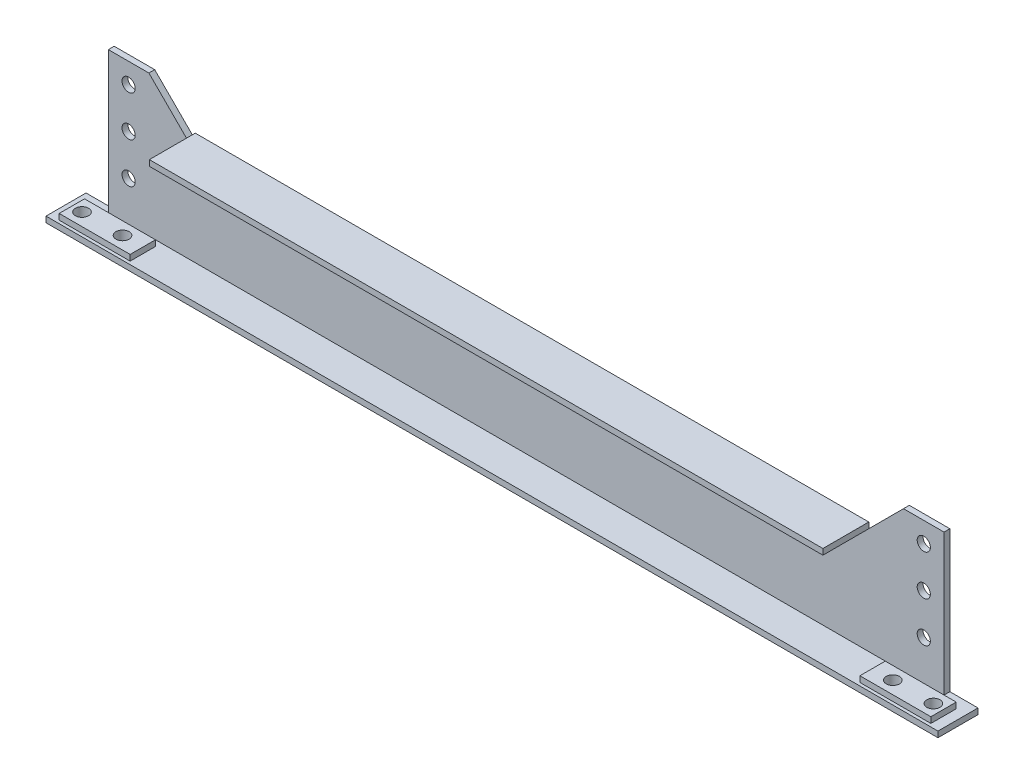
ISO-10303-21;
HEADER;
FILE_DESCRIPTION(('STEP AP214'),'2;1');
FILE_NAME('part.step','',(''),(''),'','','');
FILE_SCHEMA(('AUTOMOTIVE_DESIGN { 1 0 10303 214 1 1 1 1 }'));
ENDSEC;
DATA;
#1=APPLICATION_CONTEXT('core data for automotive mechanical design processes');
#2=APPLICATION_PROTOCOL_DEFINITION('international standard','automotive_design',2000,#1);
#3=PRODUCT_CONTEXT('',#1,'mechanical');
#4=PRODUCT('Part','Part','',(#3));
#5=PRODUCT_RELATED_PRODUCT_CATEGORY('part','',(#4));
#6=PRODUCT_DEFINITION_FORMATION('','',#4);
#7=PRODUCT_DEFINITION_CONTEXT('part definition',#1,'design');
#8=PRODUCT_DEFINITION('design','',#6,#7);
#9=PRODUCT_DEFINITION_SHAPE('','',#8);
#10=(LENGTH_UNIT() NAMED_UNIT(*) SI_UNIT(.MILLI.,.METRE.));
#11=(NAMED_UNIT(*) PLANE_ANGLE_UNIT() SI_UNIT($,.RADIAN.));
#12=(NAMED_UNIT(*) SI_UNIT($,.STERADIAN.) SOLID_ANGLE_UNIT());
#13=UNCERTAINTY_MEASURE_WITH_UNIT(LENGTH_MEASURE(1.E-05),#10,'distance_accuracy_value','');
#14=(GEOMETRIC_REPRESENTATION_CONTEXT(3) GLOBAL_UNCERTAINTY_ASSIGNED_CONTEXT((#13)) GLOBAL_UNIT_ASSIGNED_CONTEXT((#10,
#11,#12)) REPRESENTATION_CONTEXT('',''));
#15=CARTESIAN_POINT('',(0.,0.,0.));
#16=DIRECTION('',(0.,0.,1.));
#17=DIRECTION('',(1.,0.,0.));
#18=AXIS2_PLACEMENT_3D('',#15,#16,#17);
#19=CARTESIAN_POINT('',(880.,-139.25,79.));
#20=DIRECTION('',(0.,-1.,0.));
#21=DIRECTION('',(1.,0.,0.));
#22=AXIS2_PLACEMENT_3D('',#19,#20,#21);
#23=PLANE('',#22);
#24=DIRECTION('',(0.,0.,1.));
#25=VECTOR('',#24,1.);
#26=CARTESIAN_POINT('',(720.,-139.25,23.));
#27=LINE('',#26,#25);
#28=CARTESIAN_POINT('',(720.,-139.25,23.));
#29=VERTEX_POINT('',#28);
#30=CARTESIAN_POINT('',(720.,-139.25,73.));
#31=VERTEX_POINT('',#30);
#32=EDGE_CURVE('E213',#29,#31,#27,.T.);
#33=ORIENTED_EDGE('',*,*,#32,.F.);
#34=DIRECTION('',(-1.,0.,0.));
#35=VECTOR('',#34,1.);
#36=CARTESIAN_POINT('',(720.,-139.25,23.));
#37=LINE('',#36,#35);
#38=CARTESIAN_POINT('',(860.,-139.25,23.));
#39=VERTEX_POINT('',#38);
#40=EDGE_CURVE('E226',#39,#29,#37,.T.);
#41=ORIENTED_EDGE('',*,*,#40,.F.);
#42=DIRECTION('',(0.,0.,-1.));
#43=VECTOR('',#42,1.);
#44=CARTESIAN_POINT('',(860.,-139.25,23.));
#45=LINE('',#44,#43);
#46=CARTESIAN_POINT('',(860.,-139.25,73.));
#47=VERTEX_POINT('',#46);
#48=EDGE_CURVE('E235',#47,#39,#45,.T.);
#49=ORIENTED_EDGE('',*,*,#48,.F.);
#50=DIRECTION('',(1.,0.,0.));
#51=VECTOR('',#50,1.);
#52=CARTESIAN_POINT('',(720.,-139.25,73.));
#53=LINE('',#52,#51);
#54=EDGE_CURVE('E216',#31,#47,#53,.T.);
#55=ORIENTED_EDGE('',*,*,#54,.F.);
#56=EDGE_LOOP('',(#33,#41,#49,#55));
#57=FACE_BOUND('',#56,.T.);
#58=DIRECTION('',(0.,0.,-1.));
#59=VECTOR('',#58,1.);
#60=CARTESIAN_POINT('',(824.5,-139.25,11.5));
#61=LINE('',#60,#59);
#62=CARTESIAN_POINT('',(824.5,-139.25,11.5));
#63=VERTEX_POINT('',#62);
#64=CARTESIAN_POINT('',(824.5,-139.25,0.));
#65=VERTEX_POINT('',#64);
#66=EDGE_CURVE('E44',#63,#65,#61,.T.);
#67=ORIENTED_EDGE('',*,*,#66,.F.);
#68=DIRECTION('',(1.,0.,0.));
#69=VECTOR('',#68,1.);
#70=CARTESIAN_POINT('',(-824.5,-139.25,11.5));
#71=LINE('',#70,#69);
#72=CARTESIAN_POINT('',(-824.5,-139.25,11.5));
#73=VERTEX_POINT('',#72);
#74=EDGE_CURVE('E348',#73,#63,#71,.T.);
#75=ORIENTED_EDGE('',*,*,#74,.F.);
#76=DIRECTION('',(0.,0.,-1.));
#77=VECTOR('',#76,1.);
#78=CARTESIAN_POINT('',(-824.5,-139.25,11.5));
#79=LINE('',#78,#77);
#80=CARTESIAN_POINT('',(-824.5,-139.25,0.));
#81=VERTEX_POINT('',#80);
#82=EDGE_CURVE('E11',#73,#81,#79,.T.);
#83=ORIENTED_EDGE('',*,*,#82,.T.);
#84=DIRECTION('',(-1.,0.,0.));
#85=VECTOR('',#84,1.);
#86=CARTESIAN_POINT('',(880.,-139.25,0.));
#87=LINE('',#86,#85);
#88=CARTESIAN_POINT('',(-880.,-139.25,0.));
#89=VERTEX_POINT('',#88);
#90=EDGE_CURVE('E254',#81,#89,#87,.T.);
#91=ORIENTED_EDGE('',*,*,#90,.T.);
#92=DIRECTION('',(0.,0.,-1.));
#93=VECTOR('',#92,1.);
#94=CARTESIAN_POINT('',(-880.,-139.25,79.));
#95=LINE('',#94,#93);
#96=CARTESIAN_POINT('',(-880.,-139.25,79.));
#97=VERTEX_POINT('',#96);
#98=EDGE_CURVE('E277',#97,#89,#95,.T.);
#99=ORIENTED_EDGE('',*,*,#98,.F.);
#100=DIRECTION('',(-1.,0.,0.));
#101=VECTOR('',#100,1.);
#102=CARTESIAN_POINT('',(880.,-139.25,79.));
#103=LINE('',#102,#101);
#104=CARTESIAN_POINT('',(880.,-139.25,79.));
#105=VERTEX_POINT('',#104);
#106=EDGE_CURVE('E267',#105,#97,#103,.T.);
#107=ORIENTED_EDGE('',*,*,#106,.F.);
#108=DIRECTION('',(0.,0.,-1.));
#109=VECTOR('',#108,1.);
#110=CARTESIAN_POINT('',(880.,-139.25,79.));
#111=LINE('',#110,#109);
#112=CARTESIAN_POINT('',(880.,-139.25,0.));
#113=VERTEX_POINT('',#112);
#114=EDGE_CURVE('E280',#105,#113,#111,.T.);
#115=ORIENTED_EDGE('',*,*,#114,.T.);
#116=EDGE_CURVE('E255',#113,#65,#87,.T.);
#117=ORIENTED_EDGE('',*,*,#116,.T.);
#118=EDGE_LOOP('',(#67,#75,#83,#91,#99,#107,#115,#117));
#119=FACE_BOUND('',#118,.T.);
#120=DIRECTION('',(0.,0.,-1.));
#121=VECTOR('',#120,1.);
#122=CARTESIAN_POINT('',(-720.,-139.25,23.));
#123=LINE('',#122,#121);
#124=CARTESIAN_POINT('',(-720.,-139.25,73.));
#125=VERTEX_POINT('',#124);
#126=CARTESIAN_POINT('',(-720.,-139.25,23.));
#127=VERTEX_POINT('',#126);
#128=EDGE_CURVE('E212',#125,#127,#123,.T.);
#129=ORIENTED_EDGE('',*,*,#128,.F.);
#130=DIRECTION('',(1.,0.,0.));
#131=VECTOR('',#130,1.);
#132=CARTESIAN_POINT('',(-720.,-139.25,73.));
#133=LINE('',#132,#131);
#134=CARTESIAN_POINT('',(-860.,-139.25,73.));
#135=VERTEX_POINT('',#134);
#136=EDGE_CURVE('E209',#135,#125,#133,.T.);
#137=ORIENTED_EDGE('',*,*,#136,.F.);
#138=DIRECTION('',(0.,0.,1.));
#139=VECTOR('',#138,1.);
#140=CARTESIAN_POINT('',(-860.,-139.25,23.));
#141=LINE('',#140,#139);
#142=CARTESIAN_POINT('',(-860.,-139.25,23.));
#143=VERTEX_POINT('',#142);
#144=EDGE_CURVE('E57',#143,#135,#141,.T.);
#145=ORIENTED_EDGE('',*,*,#144,.F.);
#146=DIRECTION('',(-1.,0.,0.));
#147=VECTOR('',#146,1.);
#148=CARTESIAN_POINT('',(-720.,-139.25,23.));
#149=LINE('',#148,#147);
#150=EDGE_CURVE('E52',#127,#143,#149,.T.);
#151=ORIENTED_EDGE('',*,*,#150,.F.);
#152=EDGE_LOOP('',(#129,#137,#145,#151));
#153=FACE_BOUND('',#152,.T.);
#154=ADVANCED_FACE('F35',(#57,#119,#153),#23,.F.);
#155=CARTESIAN_POINT('',(-824.5,59.2499999999996,11.5));
#156=DIRECTION('',(0.,0.,1.));
#157=DIRECTION('',(1.,0.,0.));
#158=AXIS2_PLACEMENT_3D('',#155,#156,#157);
#159=PLANE('',#158);
#160=CARTESIAN_POINT('',(784.5,19.2499999999996,11.5));
#161=DIRECTION('',(0.,0.,1.));
#162=DIRECTION('',(-1.,0.,0.));
#163=AXIS2_PLACEMENT_3D('',#160,#161,#162);
#164=CIRCLE('',#163,13.);
#165=CARTESIAN_POINT('',(771.5,19.2499999999996,11.5));
#166=VERTEX_POINT('',#165);
#167=EDGE_CURVE('E316',#166,#166,#164,.T.);
#168=ORIENTED_EDGE('',*,*,#167,.F.);
#169=EDGE_LOOP('',(#168));
#170=FACE_BOUND('',#169,.T.);
#171=CARTESIAN_POINT('',(-784.5,-60.7500000000004,11.5));
#172=DIRECTION('',(0.,0.,1.));
#173=DIRECTION('',(1.,0.,0.));
#174=AXIS2_PLACEMENT_3D('',#171,#172,#173);
#175=CIRCLE('',#174,13.);
#176=CARTESIAN_POINT('',(-771.5,-60.7500000000004,11.5));
#177=VERTEX_POINT('',#176);
#178=EDGE_CURVE('E328',#177,#177,#175,.T.);
#179=ORIENTED_EDGE('',*,*,#178,.F.);
#180=EDGE_LOOP('',(#179));
#181=FACE_BOUND('',#180,.T.);
#182=CARTESIAN_POINT('',(-784.5,99.2499999999996,11.5));
#183=DIRECTION('',(0.,0.,1.));
#184=DIRECTION('',(1.,0.,0.));
#185=AXIS2_PLACEMENT_3D('',#182,#183,#184);
#186=CIRCLE('',#185,13.);
#187=CARTESIAN_POINT('',(-771.5,99.2499999999996,11.5));
#188=VERTEX_POINT('',#187);
#189=EDGE_CURVE('E340',#188,#188,#186,.T.);
#190=ORIENTED_EDGE('',*,*,#189,.F.);
#191=EDGE_LOOP('',(#190));
#192=FACE_BOUND('',#191,.T.);
#193=DIRECTION('',(0.,-1.,0.));
#194=VECTOR('',#193,1.);
#195=CARTESIAN_POINT('',(-824.5,139.25,11.5));
#196=LINE('',#195,#194);
#197=CARTESIAN_POINT('',(-824.5,139.25,11.5));
#198=VERTEX_POINT('',#197);
#199=EDGE_CURVE('E346',#198,#73,#196,.T.);
#200=ORIENTED_EDGE('',*,*,#199,.T.);
#201=ORIENTED_EDGE('',*,*,#74,.T.);
#202=DIRECTION('',(0.,1.,0.));
#203=VECTOR('',#202,1.);
#204=CARTESIAN_POINT('',(824.5,139.25,11.5));
#205=LINE('',#204,#203);
#206=CARTESIAN_POINT('',(824.5,139.25,11.5));
#207=VERTEX_POINT('',#206);
#208=EDGE_CURVE('E351',#63,#207,#205,.T.);
#209=ORIENTED_EDGE('',*,*,#208,.T.);
#210=DIRECTION('',(-1.,0.,0.));
#211=VECTOR('',#210,1.);
#212=CARTESIAN_POINT('',(744.5,139.25,11.5));
#213=LINE('',#212,#211);
#214=CARTESIAN_POINT('',(744.5,139.25,11.5));
#215=VERTEX_POINT('',#214);
#216=EDGE_CURVE('E353',#207,#215,#213,.T.);
#217=ORIENTED_EDGE('',*,*,#216,.T.);
#218=DIRECTION('',(-0.707106781186546,-0.707106781186549,0.));
#219=VECTOR('',#218,1.);
#220=CARTESIAN_POINT('',(744.5,139.25,11.5));
#221=LINE('',#220,#219);
#222=CARTESIAN_POINT('',(664.5,59.2499999999996,11.5));
#223=VERTEX_POINT('',#222);
#224=EDGE_CURVE('E355',#215,#223,#221,.T.);
#225=ORIENTED_EDGE('',*,*,#224,.T.);
#226=DIRECTION('',(-1.,0.,0.));
#227=VECTOR('',#226,1.);
#228=CARTESIAN_POINT('',(-664.5,59.2499999999996,11.5));
#229=LINE('',#228,#227);
#230=CARTESIAN_POINT('',(-664.5,59.2499999999996,11.5));
#231=VERTEX_POINT('',#230);
#232=EDGE_CURVE('E358',#223,#231,#229,.T.);
#233=ORIENTED_EDGE('',*,*,#232,.T.);
#234=DIRECTION('',(-0.707106781186547,0.707106781186548,0.));
#235=VECTOR('',#234,1.);
#236=CARTESIAN_POINT('',(-744.5,139.25,11.5));
#237=LINE('',#236,#235);
#238=CARTESIAN_POINT('',(-744.5,139.25,11.5));
#239=VERTEX_POINT('',#238);
#240=EDGE_CURVE('E361',#231,#239,#237,.T.);
#241=ORIENTED_EDGE('',*,*,#240,.T.);
#242=DIRECTION('',(-1.,0.,0.));
#243=VECTOR('',#242,1.);
#244=CARTESIAN_POINT('',(-824.5,139.25,11.5));
#245=LINE('',#244,#243);
#246=EDGE_CURVE('E363',#239,#198,#245,.T.);
#247=ORIENTED_EDGE('',*,*,#246,.T.);
#248=EDGE_LOOP('',(#200,#201,#209,#217,#225,#233,#241,#247));
#249=FACE_BOUND('',#248,.T.);
#250=CARTESIAN_POINT('',(-784.5,19.2499999999996,11.5));
#251=DIRECTION('',(0.,0.,1.));
#252=DIRECTION('',(1.,0.,0.));
#253=AXIS2_PLACEMENT_3D('',#250,#251,#252);
#254=CIRCLE('',#253,13.);
#255=CARTESIAN_POINT('',(-771.5,19.2499999999996,11.5));
#256=VERTEX_POINT('',#255);
#257=EDGE_CURVE('E334',#256,#256,#254,.T.);
#258=ORIENTED_EDGE('',*,*,#257,.F.);
#259=EDGE_LOOP('',(#258));
#260=FACE_BOUND('',#259,.T.);
#261=CARTESIAN_POINT('',(784.5,-60.7500000000004,11.5));
#262=DIRECTION('',(0.,0.,1.));
#263=DIRECTION('',(-1.,0.,0.));
#264=AXIS2_PLACEMENT_3D('',#261,#262,#263);
#265=CIRCLE('',#264,13.);
#266=CARTESIAN_POINT('',(771.5,-60.7500000000004,11.5));
#267=VERTEX_POINT('',#266);
#268=EDGE_CURVE('E322',#267,#267,#265,.T.);
#269=ORIENTED_EDGE('',*,*,#268,.F.);
#270=EDGE_LOOP('',(#269));
#271=FACE_BOUND('',#270,.T.);
#272=CARTESIAN_POINT('',(784.5,99.2499999999996,11.5));
#273=DIRECTION('',(0.,0.,1.));
#274=DIRECTION('',(-1.,0.,0.));
#275=AXIS2_PLACEMENT_3D('',#272,#273,#274);
#276=CIRCLE('',#275,13.);
#277=CARTESIAN_POINT('',(771.5,99.2499999999996,11.5));
#278=VERTEX_POINT('',#277);
#279=EDGE_CURVE('E310',#278,#278,#276,.T.);
#280=ORIENTED_EDGE('',*,*,#279,.F.);
#281=EDGE_LOOP('',(#280));
#282=FACE_BOUND('',#281,.T.);
#283=ADVANCED_FACE('F439',(#170,#181,#192,#249,#260,#271,#282),#159,.T.);
#284=CARTESIAN_POINT('',(-824.5,59.2499999999996,0.));
#285=DIRECTION('',(0.,0.,1.));
#286=DIRECTION('',(1.,0.,0.));
#287=AXIS2_PLACEMENT_3D('',#284,#285,#286);
#288=PLANE('',#287);
#289=DIRECTION('',(0.,-1.,0.));
#290=VECTOR('',#289,1.);
#291=CARTESIAN_POINT('',(-824.5,139.25,0.));
#292=LINE('',#291,#290);
#293=CARTESIAN_POINT('',(-824.5,139.25,0.));
#294=VERTEX_POINT('',#293);
#295=EDGE_CURVE('E343',#294,#81,#292,.T.);
#296=ORIENTED_EDGE('',*,*,#295,.F.);
#297=DIRECTION('',(-1.,0.,0.));
#298=VECTOR('',#297,1.);
#299=CARTESIAN_POINT('',(-824.5,139.25,0.));
#300=LINE('',#299,#298);
#301=CARTESIAN_POINT('',(-744.5,139.25,0.));
#302=VERTEX_POINT('',#301);
#303=EDGE_CURVE('E349',#302,#294,#300,.T.);
#304=ORIENTED_EDGE('',*,*,#303,.F.);
#305=DIRECTION('',(-0.707106781186547,0.707106781186548,0.));
#306=VECTOR('',#305,1.);
#307=CARTESIAN_POINT('',(-744.5,139.25,0.));
#308=LINE('',#307,#306);
#309=CARTESIAN_POINT('',(-664.5,59.2499999999996,0.));
#310=VERTEX_POINT('',#309);
#311=EDGE_CURVE('E374',#310,#302,#308,.T.);
#312=ORIENTED_EDGE('',*,*,#311,.F.);
#313=DIRECTION('',(0.,-1.,0.));
#314=VECTOR('',#313,1.);
#315=CARTESIAN_POINT('',(-664.5,59.2499999999996,0.));
#316=LINE('',#315,#314);
#317=CARTESIAN_POINT('',(-664.5,70.7499999999995,0.));
#318=VERTEX_POINT('',#317);
#319=EDGE_CURVE('E282',#318,#310,#316,.T.);
#320=ORIENTED_EDGE('',*,*,#319,.F.);
#321=DIRECTION('',(-1.,0.,0.));
#322=VECTOR('',#321,1.);
#323=CARTESIAN_POINT('',(-664.5,70.7499999999995,0.));
#324=LINE('',#323,#322);
#325=CARTESIAN_POINT('',(664.5,70.7499999999995,0.));
#326=VERTEX_POINT('',#325);
#327=EDGE_CURVE('E287',#326,#318,#324,.T.);
#328=ORIENTED_EDGE('',*,*,#327,.F.);
#329=DIRECTION('',(0.,1.,0.));
#330=VECTOR('',#329,1.);
#331=CARTESIAN_POINT('',(664.5,59.2499999999996,0.));
#332=LINE('',#331,#330);
#333=CARTESIAN_POINT('',(664.5,59.2499999999996,0.));
#334=VERTEX_POINT('',#333);
#335=EDGE_CURVE('E284',#334,#326,#332,.T.);
#336=ORIENTED_EDGE('',*,*,#335,.F.);
#337=DIRECTION('',(-0.707106781186546,-0.707106781186549,0.));
#338=VECTOR('',#337,1.);
#339=CARTESIAN_POINT('',(744.5,139.25,0.));
#340=LINE('',#339,#338);
#341=CARTESIAN_POINT('',(744.5,139.25,0.));
#342=VERTEX_POINT('',#341);
#343=EDGE_CURVE('E371',#342,#334,#340,.T.);
#344=ORIENTED_EDGE('',*,*,#343,.F.);
#345=DIRECTION('',(-1.,0.,0.));
#346=VECTOR('',#345,1.);
#347=CARTESIAN_POINT('',(744.5,139.25,0.));
#348=LINE('',#347,#346);
#349=CARTESIAN_POINT('',(824.5,139.25,0.));
#350=VERTEX_POINT('',#349);
#351=EDGE_CURVE('E369',#350,#342,#348,.T.);
#352=ORIENTED_EDGE('',*,*,#351,.F.);
#353=DIRECTION('',(0.,1.,0.));
#354=VECTOR('',#353,1.);
#355=CARTESIAN_POINT('',(824.5,139.25,0.));
#356=LINE('',#355,#354);
#357=EDGE_CURVE('E367',#65,#350,#356,.T.);
#358=ORIENTED_EDGE('',*,*,#357,.F.);
#359=ORIENTED_EDGE('',*,*,#116,.F.);
#360=DIRECTION('',(0.,1.,0.));
#361=VECTOR('',#360,1.);
#362=CARTESIAN_POINT('',(880.,-139.25,0.));
#363=LINE('',#362,#361);
#364=CARTESIAN_POINT('',(880.,-150.75,0.));
#365=VERTEX_POINT('',#364);
#366=EDGE_CURVE('E251',#365,#113,#363,.T.);
#367=ORIENTED_EDGE('',*,*,#366,.F.);
#368=DIRECTION('',(1.,0.,0.));
#369=VECTOR('',#368,1.);
#370=CARTESIAN_POINT('',(880.,-150.75,0.));
#371=LINE('',#370,#369);
#372=CARTESIAN_POINT('',(-880.,-150.75,0.));
#373=VERTEX_POINT('',#372);
#374=EDGE_CURVE('E261',#373,#365,#371,.T.);
#375=ORIENTED_EDGE('',*,*,#374,.F.);
#376=DIRECTION('',(0.,-1.,0.));
#377=VECTOR('',#376,1.);
#378=CARTESIAN_POINT('',(-880.,-139.25,0.));
#379=LINE('',#378,#377);
#380=EDGE_CURVE('E258',#89,#373,#379,.T.);
#381=ORIENTED_EDGE('',*,*,#380,.F.);
#382=ORIENTED_EDGE('',*,*,#90,.F.);
#383=EDGE_LOOP('',(#296,#304,#312,#320,#328,#336,#344,#352,#358,#359,#367,#375,#381,#382));
#384=FACE_BOUND('',#383,.T.);
#385=CARTESIAN_POINT('',(-784.5,99.2499999999996,0.));
#386=DIRECTION('',(0.,0.,1.));
#387=DIRECTION('',(1.,0.,0.));
#388=AXIS2_PLACEMENT_3D('',#385,#386,#387);
#389=CIRCLE('',#388,13.);
#390=CARTESIAN_POINT('',(-771.5,99.2499999999996,0.));
#391=VERTEX_POINT('',#390);
#392=EDGE_CURVE('E337',#391,#391,#389,.T.);
#393=ORIENTED_EDGE('',*,*,#392,.T.);
#394=EDGE_LOOP('',(#393));
#395=FACE_BOUND('',#394,.T.);
#396=CARTESIAN_POINT('',(-784.5,19.2499999999996,0.));
#397=DIRECTION('',(0.,0.,1.));
#398=DIRECTION('',(1.,0.,0.));
#399=AXIS2_PLACEMENT_3D('',#396,#397,#398);
#400=CIRCLE('',#399,13.);
#401=CARTESIAN_POINT('',(-771.5,19.2499999999996,0.));
#402=VERTEX_POINT('',#401);
#403=EDGE_CURVE('E331',#402,#402,#400,.T.);
#404=ORIENTED_EDGE('',*,*,#403,.T.);
#405=EDGE_LOOP('',(#404));
#406=FACE_BOUND('',#405,.T.);
#407=CARTESIAN_POINT('',(-784.5,-60.7500000000004,0.));
#408=DIRECTION('',(0.,0.,1.));
#409=DIRECTION('',(1.,0.,0.));
#410=AXIS2_PLACEMENT_3D('',#407,#408,#409);
#411=CIRCLE('',#410,13.);
#412=CARTESIAN_POINT('',(-771.5,-60.7500000000004,0.));
#413=VERTEX_POINT('',#412);
#414=EDGE_CURVE('E325',#413,#413,#411,.T.);
#415=ORIENTED_EDGE('',*,*,#414,.T.);
#416=EDGE_LOOP('',(#415));
#417=FACE_BOUND('',#416,.T.);
#418=CARTESIAN_POINT('',(784.5,-60.7500000000004,0.));
#419=DIRECTION('',(0.,0.,1.));
#420=DIRECTION('',(-1.,0.,0.));
#421=AXIS2_PLACEMENT_3D('',#418,#419,#420);
#422=CIRCLE('',#421,13.);
#423=CARTESIAN_POINT('',(771.5,-60.7500000000004,0.));
#424=VERTEX_POINT('',#423);
#425=EDGE_CURVE('E319',#424,#424,#422,.T.);
#426=ORIENTED_EDGE('',*,*,#425,.T.);
#427=EDGE_LOOP('',(#426));
#428=FACE_BOUND('',#427,.T.);
#429=CARTESIAN_POINT('',(784.5,19.2499999999996,0.));
#430=DIRECTION('',(0.,0.,1.));
#431=DIRECTION('',(-1.,0.,0.));
#432=AXIS2_PLACEMENT_3D('',#429,#430,#431);
#433=CIRCLE('',#432,13.);
#434=CARTESIAN_POINT('',(771.5,19.2499999999996,0.));
#435=VERTEX_POINT('',#434);
#436=EDGE_CURVE('E313',#435,#435,#433,.T.);
#437=ORIENTED_EDGE('',*,*,#436,.T.);
#438=EDGE_LOOP('',(#437));
#439=FACE_BOUND('',#438,.T.);
#440=CARTESIAN_POINT('',(784.5,99.2499999999996,0.));
#441=DIRECTION('',(0.,0.,1.));
#442=DIRECTION('',(-1.,0.,0.));
#443=AXIS2_PLACEMENT_3D('',#440,#441,#442);
#444=CIRCLE('',#443,13.);
#445=CARTESIAN_POINT('',(771.5,99.2499999999996,0.));
#446=VERTEX_POINT('',#445);
#447=EDGE_CURVE('E309',#446,#446,#444,.T.);
#448=ORIENTED_EDGE('',*,*,#447,.T.);
#449=EDGE_LOOP('',(#448));
#450=FACE_BOUND('',#449,.T.);
#451=ADVANCED_FACE('F445',(#384,#395,#406,#417,#428,#439,#450),#288,.F.);
#452=CARTESIAN_POINT('',(-824.5,139.25,11.5));
#453=DIRECTION('',(1.,0.,0.));
#454=DIRECTION('',(0.,0.,-1.));
#455=AXIS2_PLACEMENT_3D('',#452,#453,#454);
#456=PLANE('',#455);
#457=ORIENTED_EDGE('',*,*,#295,.T.);
#458=ORIENTED_EDGE('',*,*,#82,.F.);
#459=ORIENTED_EDGE('',*,*,#199,.F.);
#460=DIRECTION('',(0.,0.,-1.));
#461=VECTOR('',#460,1.);
#462=CARTESIAN_POINT('',(-824.5,139.25,11.5));
#463=LINE('',#462,#461);
#464=EDGE_CURVE('E365',#198,#294,#463,.T.);
#465=ORIENTED_EDGE('',*,*,#464,.T.);
#466=EDGE_LOOP('',(#457,#458,#459,#465));
#467=FACE_BOUND('',#466,.T.);
#468=ADVANCED_FACE('F37',(#467),#456,.F.);
#469=CARTESIAN_POINT('',(824.5,139.25,11.5));
#470=DIRECTION('',(-1.,0.,0.));
#471=DIRECTION('',(0.,0.,1.));
#472=AXIS2_PLACEMENT_3D('',#469,#470,#471);
#473=PLANE('',#472);
#474=ORIENTED_EDGE('',*,*,#357,.T.);
#475=DIRECTION('',(0.,0.,-1.));
#476=VECTOR('',#475,1.);
#477=CARTESIAN_POINT('',(824.5,139.25,11.5));
#478=LINE('',#477,#476);
#479=EDGE_CURVE('E390',#207,#350,#478,.T.);
#480=ORIENTED_EDGE('',*,*,#479,.F.);
#481=ORIENTED_EDGE('',*,*,#208,.F.);
#482=ORIENTED_EDGE('',*,*,#66,.T.);
#483=EDGE_LOOP('',(#474,#480,#481,#482));
#484=FACE_BOUND('',#483,.T.);
#485=ADVANCED_FACE('F518',(#484),#473,.F.);
#486=CARTESIAN_POINT('',(744.5,139.25,11.5));
#487=DIRECTION('',(0.,-1.,0.));
#488=DIRECTION('',(1.,0.,0.));
#489=AXIS2_PLACEMENT_3D('',#486,#487,#488);
#490=PLANE('',#489);
#491=ORIENTED_EDGE('',*,*,#351,.T.);
#492=DIRECTION('',(0.,0.,-1.));
#493=VECTOR('',#492,1.);
#494=CARTESIAN_POINT('',(744.5,139.25,11.5));
#495=LINE('',#494,#493);
#496=EDGE_CURVE('E387',#215,#342,#495,.T.);
#497=ORIENTED_EDGE('',*,*,#496,.F.);
#498=ORIENTED_EDGE('',*,*,#216,.F.);
#499=ORIENTED_EDGE('',*,*,#479,.T.);
#500=EDGE_LOOP('',(#491,#497,#498,#499));
#501=FACE_BOUND('',#500,.T.);
#502=ADVANCED_FACE('F515',(#501),#490,.F.);
#503=CARTESIAN_POINT('',(744.5,139.25,11.5));
#504=DIRECTION('',(0.707106781186549,-0.707106781186546,0.));
#505=DIRECTION('',(0.707106781186546,0.707106781186549,0.));
#506=AXIS2_PLACEMENT_3D('',#503,#504,#505);
#507=PLANE('',#506);
#508=ORIENTED_EDGE('',*,*,#343,.T.);
#509=DIRECTION('',(0.,0.,-1.));
#510=VECTOR('',#509,1.);
#511=CARTESIAN_POINT('',(664.5,59.2499999999996,11.5));
#512=LINE('',#511,#510);
#513=EDGE_CURVE('E385',#223,#334,#512,.T.);
#514=ORIENTED_EDGE('',*,*,#513,.F.);
#515=ORIENTED_EDGE('',*,*,#224,.F.);
#516=ORIENTED_EDGE('',*,*,#496,.T.);
#517=EDGE_LOOP('',(#508,#514,#515,#516));
#518=FACE_BOUND('',#517,.T.);
#519=ADVANCED_FACE('F511',(#518),#507,.F.);
#520=CARTESIAN_POINT('',(-744.5,139.25,11.5));
#521=DIRECTION('',(-0.707106781186548,-0.707106781186547,0.));
#522=DIRECTION('',(0.707106781186547,-0.707106781186548,0.));
#523=AXIS2_PLACEMENT_3D('',#520,#521,#522);
#524=PLANE('',#523);
#525=ORIENTED_EDGE('',*,*,#311,.T.);
#526=DIRECTION('',(0.,0.,-1.));
#527=VECTOR('',#526,1.);
#528=CARTESIAN_POINT('',(-744.5,139.25,11.5));
#529=LINE('',#528,#527);
#530=EDGE_CURVE('E379',#239,#302,#529,.T.);
#531=ORIENTED_EDGE('',*,*,#530,.F.);
#532=ORIENTED_EDGE('',*,*,#240,.F.);
#533=DIRECTION('',(0.,0.,-1.));
#534=VECTOR('',#533,1.);
#535=CARTESIAN_POINT('',(-664.5,59.2499999999996,11.5));
#536=LINE('',#535,#534);
#537=EDGE_CURVE('E382',#231,#310,#536,.T.);
#538=ORIENTED_EDGE('',*,*,#537,.T.);
#539=EDGE_LOOP('',(#525,#531,#532,#538));
#540=FACE_BOUND('',#539,.T.);
#541=ADVANCED_FACE('F507',(#540),#524,.F.);
#542=CARTESIAN_POINT('',(-824.5,139.25,11.5));
#543=DIRECTION('',(0.,-1.,0.));
#544=DIRECTION('',(1.,0.,0.));
#545=AXIS2_PLACEMENT_3D('',#542,#543,#544);
#546=PLANE('',#545);
#547=ORIENTED_EDGE('',*,*,#303,.T.);
#548=ORIENTED_EDGE('',*,*,#464,.F.);
#549=ORIENTED_EDGE('',*,*,#246,.F.);
#550=ORIENTED_EDGE('',*,*,#530,.T.);
#551=EDGE_LOOP('',(#547,#548,#549,#550));
#552=FACE_BOUND('',#551,.T.);
#553=ADVANCED_FACE('F499',(#552),#546,.F.);
#554=CARTESIAN_POINT('',(-784.5,99.2499999999996,11.5));
#555=DIRECTION('',(0.,0.,-1.));
#556=DIRECTION('',(-1.,0.,0.));
#557=AXIS2_PLACEMENT_3D('',#554,#555,#556);
#558=CYLINDRICAL_SURFACE('',#557,13.);
#559=ORIENTED_EDGE('',*,*,#189,.T.);
#560=EDGE_LOOP('',(#559));
#561=FACE_BOUND('',#560,.T.);
#562=ORIENTED_EDGE('',*,*,#392,.F.);
#563=EDGE_LOOP('',(#562));
#564=FACE_BOUND('',#563,.T.);
#565=ADVANCED_FACE('F496',(#561,#564),#558,.F.);
#566=CARTESIAN_POINT('',(-784.5,19.2499999999996,11.5));
#567=DIRECTION('',(0.,0.,-1.));
#568=DIRECTION('',(-1.,0.,0.));
#569=AXIS2_PLACEMENT_3D('',#566,#567,#568);
#570=CYLINDRICAL_SURFACE('',#569,13.);
#571=ORIENTED_EDGE('',*,*,#257,.T.);
#572=EDGE_LOOP('',(#571));
#573=FACE_BOUND('',#572,.T.);
#574=ORIENTED_EDGE('',*,*,#403,.F.);
#575=EDGE_LOOP('',(#574));
#576=FACE_BOUND('',#575,.T.);
#577=ADVANCED_FACE('F492',(#573,#576),#570,.F.);
#578=CARTESIAN_POINT('',(-784.5,-60.7500000000004,11.5));
#579=DIRECTION('',(0.,0.,-1.));
#580=DIRECTION('',(-1.,0.,0.));
#581=AXIS2_PLACEMENT_3D('',#578,#579,#580);
#582=CYLINDRICAL_SURFACE('',#581,13.);
#583=ORIENTED_EDGE('',*,*,#178,.T.);
#584=EDGE_LOOP('',(#583));
#585=FACE_BOUND('',#584,.T.);
#586=ORIENTED_EDGE('',*,*,#414,.F.);
#587=EDGE_LOOP('',(#586));
#588=FACE_BOUND('',#587,.T.);
#589=ADVANCED_FACE('F488',(#585,#588),#582,.F.);
#590=CARTESIAN_POINT('',(784.5,-60.7500000000004,11.5));
#591=DIRECTION('',(0.,0.,-1.));
#592=DIRECTION('',(-1.,0.,0.));
#593=AXIS2_PLACEMENT_3D('',#590,#591,#592);
#594=CYLINDRICAL_SURFACE('',#593,13.);
#595=ORIENTED_EDGE('',*,*,#268,.T.);
#596=EDGE_LOOP('',(#595));
#597=FACE_BOUND('',#596,.T.);
#598=ORIENTED_EDGE('',*,*,#425,.F.);
#599=EDGE_LOOP('',(#598));
#600=FACE_BOUND('',#599,.T.);
#601=ADVANCED_FACE('F484',(#597,#600),#594,.F.);
#602=CARTESIAN_POINT('',(784.5,19.2499999999996,11.5));
#603=DIRECTION('',(0.,0.,-1.));
#604=DIRECTION('',(-1.,0.,0.));
#605=AXIS2_PLACEMENT_3D('',#602,#603,#604);
#606=CYLINDRICAL_SURFACE('',#605,13.);
#607=ORIENTED_EDGE('',*,*,#167,.T.);
#608=EDGE_LOOP('',(#607));
#609=FACE_BOUND('',#608,.T.);
#610=ORIENTED_EDGE('',*,*,#436,.F.);
#611=EDGE_LOOP('',(#610));
#612=FACE_BOUND('',#611,.T.);
#613=ADVANCED_FACE('F480',(#609,#612),#606,.F.);
#614=CARTESIAN_POINT('',(784.5,99.2499999999996,11.5));
#615=DIRECTION('',(0.,0.,-1.));
#616=DIRECTION('',(-1.,0.,0.));
#617=AXIS2_PLACEMENT_3D('',#614,#615,#616);
#618=CYLINDRICAL_SURFACE('',#617,13.);
#619=ORIENTED_EDGE('',*,*,#279,.T.);
#620=EDGE_LOOP('',(#619));
#621=FACE_BOUND('',#620,.T.);
#622=ORIENTED_EDGE('',*,*,#447,.F.);
#623=EDGE_LOOP('',(#622));
#624=FACE_BOUND('',#623,.T.);
#625=ADVANCED_FACE('F476',(#621,#624),#618,.F.);
#626=CARTESIAN_POINT('',(-664.5,59.2499999999996,90.5));
#627=DIRECTION('',(1.,0.,0.));
#628=DIRECTION('',(0.,0.,-1.));
#629=AXIS2_PLACEMENT_3D('',#626,#627,#628);
#630=PLANE('',#629);
#631=DIRECTION('',(0.,0.,-1.));
#632=VECTOR('',#631,1.);
#633=CARTESIAN_POINT('',(-664.5,70.7499999999995,90.5));
#634=LINE('',#633,#632);
#635=CARTESIAN_POINT('',(-664.5,70.7499999999995,90.5));
#636=VERTEX_POINT('',#635);
#637=EDGE_CURVE('E299',#636,#318,#634,.T.);
#638=ORIENTED_EDGE('',*,*,#637,.T.);
#639=ORIENTED_EDGE('',*,*,#319,.T.);
#640=ORIENTED_EDGE('',*,*,#537,.F.);
#641=DIRECTION('',(0.,0.,-1.));
#642=VECTOR('',#641,1.);
#643=CARTESIAN_POINT('',(-664.5,59.2499999999996,90.5));
#644=LINE('',#643,#642);
#645=CARTESIAN_POINT('',(-664.5,59.2499999999996,90.5));
#646=VERTEX_POINT('',#645);
#647=EDGE_CURVE('E306',#646,#231,#644,.T.);
#648=ORIENTED_EDGE('',*,*,#647,.F.);
#649=DIRECTION('',(0.,-1.,0.));
#650=VECTOR('',#649,1.);
#651=CARTESIAN_POINT('',(-664.5,59.2499999999996,90.5));
#652=LINE('',#651,#650);
#653=EDGE_CURVE('E290',#636,#646,#652,.T.);
#654=ORIENTED_EDGE('',*,*,#653,.F.);
#655=EDGE_LOOP('',(#638,#639,#640,#648,#654));
#656=FACE_BOUND('',#655,.T.);
#657=ADVANCED_FACE('F472',(#656),#630,.F.);
#658=CARTESIAN_POINT('',(-664.5,59.2499999999996,90.5));
#659=DIRECTION('',(0.,1.,0.));
#660=DIRECTION('',(0.,0.,1.));
#661=AXIS2_PLACEMENT_3D('',#658,#659,#660);
#662=PLANE('',#661);
#663=ORIENTED_EDGE('',*,*,#232,.F.);
#664=DIRECTION('',(0.,0.,-1.));
#665=VECTOR('',#664,1.);
#666=CARTESIAN_POINT('',(664.5,59.2499999999996,90.5));
#667=LINE('',#666,#665);
#668=CARTESIAN_POINT('',(664.5,59.2499999999996,90.5));
#669=VERTEX_POINT('',#668);
#670=EDGE_CURVE('E303',#669,#223,#667,.T.);
#671=ORIENTED_EDGE('',*,*,#670,.F.);
#672=DIRECTION('',(1.,0.,0.));
#673=VECTOR('',#672,1.);
#674=CARTESIAN_POINT('',(-664.5,59.2499999999996,90.5));
#675=LINE('',#674,#673);
#676=EDGE_CURVE('E293',#646,#669,#675,.T.);
#677=ORIENTED_EDGE('',*,*,#676,.F.);
#678=ORIENTED_EDGE('',*,*,#647,.T.);
#679=EDGE_LOOP('',(#663,#671,#677,#678));
#680=FACE_BOUND('',#679,.T.);
#681=ADVANCED_FACE('F468',(#680),#662,.F.);
#682=CARTESIAN_POINT('',(664.5,59.2499999999996,90.5));
#683=DIRECTION('',(-1.,0.,0.));
#684=DIRECTION('',(0.,0.,1.));
#685=AXIS2_PLACEMENT_3D('',#682,#683,#684);
#686=PLANE('',#685);
#687=ORIENTED_EDGE('',*,*,#670,.T.);
#688=ORIENTED_EDGE('',*,*,#513,.T.);
#689=ORIENTED_EDGE('',*,*,#335,.T.);
#690=DIRECTION('',(0.,0.,-1.));
#691=VECTOR('',#690,1.);
#692=CARTESIAN_POINT('',(664.5,70.7499999999995,90.5));
#693=LINE('',#692,#691);
#694=CARTESIAN_POINT('',(664.5,70.7499999999995,90.5));
#695=VERTEX_POINT('',#694);
#696=EDGE_CURVE('E301',#695,#326,#693,.T.);
#697=ORIENTED_EDGE('',*,*,#696,.F.);
#698=DIRECTION('',(0.,1.,0.));
#699=VECTOR('',#698,1.);
#700=CARTESIAN_POINT('',(664.5,59.2499999999996,90.5));
#701=LINE('',#700,#699);
#702=EDGE_CURVE('E295',#669,#695,#701,.T.);
#703=ORIENTED_EDGE('',*,*,#702,.F.);
#704=EDGE_LOOP('',(#687,#688,#689,#697,#703));
#705=FACE_BOUND('',#704,.T.);
#706=ADVANCED_FACE('F464',(#705),#686,.F.);
#707=CARTESIAN_POINT('',(-664.5,70.7499999999995,90.5));
#708=DIRECTION('',(0.,-1.,0.));
#709=DIRECTION('',(0.,0.,-1.));
#710=AXIS2_PLACEMENT_3D('',#707,#708,#709);
#711=PLANE('',#710);
#712=ORIENTED_EDGE('',*,*,#696,.T.);
#713=ORIENTED_EDGE('',*,*,#327,.T.);
#714=ORIENTED_EDGE('',*,*,#637,.F.);
#715=DIRECTION('',(-1.,0.,0.));
#716=VECTOR('',#715,1.);
#717=CARTESIAN_POINT('',(-664.5,70.7499999999995,90.5));
#718=LINE('',#717,#716);
#719=EDGE_CURVE('E297',#695,#636,#718,.T.);
#720=ORIENTED_EDGE('',*,*,#719,.F.);
#721=EDGE_LOOP('',(#712,#713,#714,#720));
#722=FACE_BOUND('',#721,.T.);
#723=ADVANCED_FACE('F460',(#722),#711,.F.);
#724=CARTESIAN_POINT('',(-664.5,70.7499999999995,90.5));
#725=DIRECTION('',(0.,0.,-1.));
#726=DIRECTION('',(-1.,0.,0.));
#727=AXIS2_PLACEMENT_3D('',#724,#725,#726);
#728=PLANE('',#727);
#729=ORIENTED_EDGE('',*,*,#653,.T.);
#730=ORIENTED_EDGE('',*,*,#676,.T.);
#731=ORIENTED_EDGE('',*,*,#702,.T.);
#732=ORIENTED_EDGE('',*,*,#719,.T.);
#733=EDGE_LOOP('',(#729,#730,#731,#732));
#734=FACE_BOUND('',#733,.T.);
#735=ADVANCED_FACE('F456',(#734),#728,.F.);
#736=CARTESIAN_POINT('',(880.,-139.25,79.));
#737=DIRECTION('',(-1.,0.,0.));
#738=DIRECTION('',(0.,-1.,0.));
#739=AXIS2_PLACEMENT_3D('',#736,#737,#738);
#740=PLANE('',#739);
#741=DIRECTION('',(0.,0.,-1.));
#742=VECTOR('',#741,1.);
#743=CARTESIAN_POINT('',(880.,-150.75,79.));
#744=LINE('',#743,#742);
#745=CARTESIAN_POINT('',(880.,-150.75,79.));
#746=VERTEX_POINT('',#745);
#747=EDGE_CURVE('E273',#746,#365,#744,.T.);
#748=ORIENTED_EDGE('',*,*,#747,.T.);
#749=ORIENTED_EDGE('',*,*,#366,.T.);
#750=ORIENTED_EDGE('',*,*,#114,.F.);
#751=DIRECTION('',(0.,1.,0.));
#752=VECTOR('',#751,1.);
#753=CARTESIAN_POINT('',(880.,-139.25,79.));
#754=LINE('',#753,#752);
#755=EDGE_CURVE('E264',#746,#105,#754,.T.);
#756=ORIENTED_EDGE('',*,*,#755,.F.);
#757=EDGE_LOOP('',(#748,#749,#750,#756));
#758=FACE_BOUND('',#757,.T.);
#759=ADVANCED_FACE('F453',(#758),#740,.F.);
#760=CARTESIAN_POINT('',(-880.,-139.25,79.));
#761=DIRECTION('',(1.,0.,0.));
#762=DIRECTION('',(0.,1.,0.));
#763=AXIS2_PLACEMENT_3D('',#760,#761,#762);
#764=PLANE('',#763);
#765=ORIENTED_EDGE('',*,*,#98,.T.);
#766=ORIENTED_EDGE('',*,*,#380,.T.);
#767=DIRECTION('',(0.,0.,-1.));
#768=VECTOR('',#767,1.);
#769=CARTESIAN_POINT('',(-880.,-150.75,79.));
#770=LINE('',#769,#768);
#771=CARTESIAN_POINT('',(-880.,-150.75,79.));
#772=VERTEX_POINT('',#771);
#773=EDGE_CURVE('E275',#772,#373,#770,.T.);
#774=ORIENTED_EDGE('',*,*,#773,.F.);
#775=DIRECTION('',(0.,-1.,0.));
#776=VECTOR('',#775,1.);
#777=CARTESIAN_POINT('',(-880.,-139.25,79.));
#778=LINE('',#777,#776);
#779=EDGE_CURVE('E269',#97,#772,#778,.T.);
#780=ORIENTED_EDGE('',*,*,#779,.F.);
#781=EDGE_LOOP('',(#765,#766,#774,#780));
#782=FACE_BOUND('',#781,.T.);
#783=ADVANCED_FACE('F451',(#782),#764,.F.);
#784=CARTESIAN_POINT('',(880.,-150.75,79.));
#785=DIRECTION('',(0.,1.,0.));
#786=DIRECTION('',(-1.,0.,0.));
#787=AXIS2_PLACEMENT_3D('',#784,#785,#786);
#788=PLANE('',#787);
#789=CARTESIAN_POINT('',(-760.,-150.75,48.));
#790=DIRECTION('',(0.,-1.,0.));
#791=DIRECTION('',(1.,0.,0.));
#792=AXIS2_PLACEMENT_3D('',#789,#790,#791);
#793=CIRCLE('',#792,13.);
#794=CARTESIAN_POINT('',(-747.,-150.75,48.));
#795=VERTEX_POINT('',#794);
#796=EDGE_CURVE('E401',#795,#795,#793,.T.);
#797=ORIENTED_EDGE('',*,*,#796,.F.);
#798=EDGE_LOOP('',(#797));
#799=FACE_BOUND('',#798,.T.);
#800=CARTESIAN_POINT('',(760.,-150.75,48.));
#801=DIRECTION('',(0.,-1.,0.));
#802=DIRECTION('',(-1.,0.,0.));
#803=AXIS2_PLACEMENT_3D('',#800,#801,#802);
#804=CIRCLE('',#803,13.);
#805=CARTESIAN_POINT('',(747.,-150.75,48.));
#806=VERTEX_POINT('',#805);
#807=EDGE_CURVE('E690',#806,#806,#804,.T.);
#808=ORIENTED_EDGE('',*,*,#807,.F.);
#809=EDGE_LOOP('',(#808));
#810=FACE_BOUND('',#809,.T.);
#811=CARTESIAN_POINT('',(840.,-150.75,48.));
#812=DIRECTION('',(0.,-1.,0.));
#813=DIRECTION('',(-1.,0.,0.));
#814=AXIS2_PLACEMENT_3D('',#811,#812,#813);
#815=CIRCLE('',#814,13.);
#816=CARTESIAN_POINT('',(827.,-150.75,48.));
#817=VERTEX_POINT('',#816);
#818=EDGE_CURVE('E413',#817,#817,#815,.T.);
#819=ORIENTED_EDGE('',*,*,#818,.F.);
#820=EDGE_LOOP('',(#819));
#821=FACE_BOUND('',#820,.T.);
#822=CARTESIAN_POINT('',(-840.,-150.75,48.));
#823=DIRECTION('',(0.,-1.,0.));
#824=DIRECTION('',(1.,0.,0.));
#825=AXIS2_PLACEMENT_3D('',#822,#823,#824);
#826=CIRCLE('',#825,13.);
#827=CARTESIAN_POINT('',(-827.,-150.75,48.));
#828=VERTEX_POINT('',#827);
#829=EDGE_CURVE('E397',#828,#828,#826,.T.);
#830=ORIENTED_EDGE('',*,*,#829,.F.);
#831=EDGE_LOOP('',(#830));
#832=FACE_BOUND('',#831,.T.);
#833=ORIENTED_EDGE('',*,*,#773,.T.);
#834=ORIENTED_EDGE('',*,*,#374,.T.);
#835=ORIENTED_EDGE('',*,*,#747,.F.);
#836=DIRECTION('',(1.,0.,0.));
#837=VECTOR('',#836,1.);
#838=CARTESIAN_POINT('',(880.,-150.75,79.));
#839=LINE('',#838,#837);
#840=EDGE_CURVE('E271',#772,#746,#839,.T.);
#841=ORIENTED_EDGE('',*,*,#840,.F.);
#842=EDGE_LOOP('',(#833,#834,#835,#841));
#843=FACE_BOUND('',#842,.T.);
#844=ADVANCED_FACE('F552',(#799,#810,#821,#832,#843),#788,.F.);
#845=CARTESIAN_POINT('',(880.,-150.75,79.));
#846=DIRECTION('',(0.,0.,-1.));
#847=DIRECTION('',(-1.,0.,0.));
#848=AXIS2_PLACEMENT_3D('',#845,#846,#847);
#849=PLANE('',#848);
#850=ORIENTED_EDGE('',*,*,#755,.T.);
#851=ORIENTED_EDGE('',*,*,#106,.T.);
#852=ORIENTED_EDGE('',*,*,#779,.T.);
#853=ORIENTED_EDGE('',*,*,#840,.T.);
#854=EDGE_LOOP('',(#850,#851,#852,#853));
#855=FACE_BOUND('',#854,.T.);
#856=ADVANCED_FACE('F575',(#855),#849,.F.);
#857=CARTESIAN_POINT('',(720.,-127.75,23.));
#858=DIRECTION('',(1.,0.,0.));
#859=DIRECTION('',(0.,1.,0.));
#860=AXIS2_PLACEMENT_3D('',#857,#858,#859);
#861=PLANE('',#860);
#862=ORIENTED_EDGE('',*,*,#32,.T.);
#863=DIRECTION('',(0.,-1.,0.));
#864=VECTOR('',#863,1.);
#865=CARTESIAN_POINT('',(720.,-127.75,73.));
#866=LINE('',#865,#864);
#867=CARTESIAN_POINT('',(720.,-127.75,73.));
#868=VERTEX_POINT('',#867);
#869=EDGE_CURVE('E248',#868,#31,#866,.T.);
#870=ORIENTED_EDGE('',*,*,#869,.F.);
#871=DIRECTION('',(0.,0.,1.));
#872=VECTOR('',#871,1.);
#873=CARTESIAN_POINT('',(720.,-127.75,23.));
#874=LINE('',#873,#872);
#875=CARTESIAN_POINT('',(720.,-127.75,23.));
#876=VERTEX_POINT('',#875);
#877=EDGE_CURVE('E222',#876,#868,#874,.T.);
#878=ORIENTED_EDGE('',*,*,#877,.F.);
#879=DIRECTION('',(0.,-1.,0.));
#880=VECTOR('',#879,1.);
#881=CARTESIAN_POINT('',(720.,-127.75,23.));
#882=LINE('',#881,#880);
#883=EDGE_CURVE('E231',#876,#29,#882,.T.);
#884=ORIENTED_EDGE('',*,*,#883,.T.);
#885=EDGE_LOOP('',(#862,#870,#878,#884));
#886=FACE_BOUND('',#885,.T.);
#887=ADVANCED_FACE('F577',(#886),#861,.F.);
#888=CARTESIAN_POINT('',(720.,-127.75,73.));
#889=DIRECTION('',(0.,0.,-1.));
#890=DIRECTION('',(-1.,0.,0.));
#891=AXIS2_PLACEMENT_3D('',#888,#889,#890);
#892=PLANE('',#891);
#893=ORIENTED_EDGE('',*,*,#54,.T.);
#894=DIRECTION('',(0.,-1.,0.));
#895=VECTOR('',#894,1.);
#896=CARTESIAN_POINT('',(860.,-127.75,73.));
#897=LINE('',#896,#895);
#898=CARTESIAN_POINT('',(860.,-127.75,73.));
#899=VERTEX_POINT('',#898);
#900=EDGE_CURVE('E245',#899,#47,#897,.T.);
#901=ORIENTED_EDGE('',*,*,#900,.F.);
#902=DIRECTION('',(1.,0.,0.));
#903=VECTOR('',#902,1.);
#904=CARTESIAN_POINT('',(720.,-127.75,73.));
#905=LINE('',#904,#903);
#906=EDGE_CURVE('E225',#868,#899,#905,.T.);
#907=ORIENTED_EDGE('',*,*,#906,.F.);
#908=ORIENTED_EDGE('',*,*,#869,.T.);
#909=EDGE_LOOP('',(#893,#901,#907,#908));
#910=FACE_BOUND('',#909,.T.);
#911=ADVANCED_FACE('F583',(#910),#892,.F.);
#912=CARTESIAN_POINT('',(860.,-127.75,23.));
#913=DIRECTION('',(-1.,0.,0.));
#914=DIRECTION('',(0.,-1.,0.));
#915=AXIS2_PLACEMENT_3D('',#912,#913,#914);
#916=PLANE('',#915);
#917=ORIENTED_EDGE('',*,*,#48,.T.);
#918=DIRECTION('',(0.,-1.,0.));
#919=VECTOR('',#918,1.);
#920=CARTESIAN_POINT('',(860.,-127.75,23.));
#921=LINE('',#920,#919);
#922=CARTESIAN_POINT('',(860.,-127.75,23.));
#923=VERTEX_POINT('',#922);
#924=EDGE_CURVE('E242',#923,#39,#921,.T.);
#925=ORIENTED_EDGE('',*,*,#924,.F.);
#926=DIRECTION('',(0.,0.,-1.));
#927=VECTOR('',#926,1.);
#928=CARTESIAN_POINT('',(860.,-127.75,23.));
#929=LINE('',#928,#927);
#930=EDGE_CURVE('E228',#899,#923,#929,.T.);
#931=ORIENTED_EDGE('',*,*,#930,.F.);
#932=ORIENTED_EDGE('',*,*,#900,.T.);
#933=EDGE_LOOP('',(#917,#925,#931,#932));
#934=FACE_BOUND('',#933,.T.);
#935=ADVANCED_FACE('F590',(#934),#916,.F.);
#936=CARTESIAN_POINT('',(720.,-127.75,23.));
#937=DIRECTION('',(0.,0.,1.));
#938=DIRECTION('',(1.,0.,0.));
#939=AXIS2_PLACEMENT_3D('',#936,#937,#938);
#940=PLANE('',#939);
#941=ORIENTED_EDGE('',*,*,#40,.T.);
#942=ORIENTED_EDGE('',*,*,#883,.F.);
#943=DIRECTION('',(-1.,0.,0.));
#944=VECTOR('',#943,1.);
#945=CARTESIAN_POINT('',(720.,-127.75,23.));
#946=LINE('',#945,#944);
#947=EDGE_CURVE('E230',#923,#876,#946,.T.);
#948=ORIENTED_EDGE('',*,*,#947,.F.);
#949=ORIENTED_EDGE('',*,*,#924,.T.);
#950=EDGE_LOOP('',(#941,#942,#948,#949));
#951=FACE_BOUND('',#950,.T.);
#952=ADVANCED_FACE('F594',(#951),#940,.F.);
#953=CARTESIAN_POINT('',(720.,-127.75,23.));
#954=DIRECTION('',(0.,1.,0.));
#955=DIRECTION('',(-1.,0.,0.));
#956=AXIS2_PLACEMENT_3D('',#953,#954,#955);
#957=PLANE('',#956);
#958=CARTESIAN_POINT('',(760.,-127.75,48.));
#959=DIRECTION('',(0.,1.,0.));
#960=DIRECTION('',(-1.,0.,0.));
#961=AXIS2_PLACEMENT_3D('',#958,#959,#960);
#962=CIRCLE('',#961,13.);
#963=CARTESIAN_POINT('',(747.,-127.75,48.));
#964=VERTEX_POINT('',#963);
#965=EDGE_CURVE('E39',#964,#964,#962,.T.);
#966=ORIENTED_EDGE('',*,*,#965,.F.);
#967=EDGE_LOOP('',(#966));
#968=FACE_BOUND('',#967,.T.);
#969=CARTESIAN_POINT('',(840.,-127.75,48.));
#970=DIRECTION('',(0.,1.,0.));
#971=DIRECTION('',(-1.,0.,0.));
#972=AXIS2_PLACEMENT_3D('',#969,#970,#971);
#973=CIRCLE('',#972,13.);
#974=CARTESIAN_POINT('',(827.,-127.75,48.));
#975=VERTEX_POINT('',#974);
#976=EDGE_CURVE('E400',#975,#975,#973,.T.);
#977=ORIENTED_EDGE('',*,*,#976,.F.);
#978=EDGE_LOOP('',(#977));
#979=FACE_BOUND('',#978,.T.);
#980=ORIENTED_EDGE('',*,*,#877,.T.);
#981=ORIENTED_EDGE('',*,*,#906,.T.);
#982=ORIENTED_EDGE('',*,*,#930,.T.);
#983=ORIENTED_EDGE('',*,*,#947,.T.);
#984=EDGE_LOOP('',(#980,#981,#982,#983));
#985=FACE_BOUND('',#984,.T.);
#986=ADVANCED_FACE('F598',(#968,#979,#985),#957,.T.);
#987=CARTESIAN_POINT('',(-720.,-127.75,23.));
#988=DIRECTION('',(-1.,0.,0.));
#989=DIRECTION('',(0.,-1.,0.));
#990=AXIS2_PLACEMENT_3D('',#987,#988,#989);
#991=PLANE('',#990);
#992=ORIENTED_EDGE('',*,*,#128,.T.);
#993=DIRECTION('',(0.,-1.,0.));
#994=VECTOR('',#993,1.);
#995=CARTESIAN_POINT('',(-720.,-127.75,23.));
#996=LINE('',#995,#994);
#997=CARTESIAN_POINT('',(-720.,-127.75,23.));
#998=VERTEX_POINT('',#997);
#999=EDGE_CURVE('E193',#998,#127,#996,.T.);
#1000=ORIENTED_EDGE('',*,*,#999,.F.);
#1001=DIRECTION('',(0.,0.,-1.));
#1002=VECTOR('',#1001,1.);
#1003=CARTESIAN_POINT('',(-720.,-127.75,23.));
#1004=LINE('',#1003,#1002);
#1005=CARTESIAN_POINT('',(-720.,-127.75,73.));
#1006=VERTEX_POINT('',#1005);
#1007=EDGE_CURVE('E200',#1006,#998,#1004,.T.);
#1008=ORIENTED_EDGE('',*,*,#1007,.F.);
#1009=DIRECTION('',(0.,-1.,0.));
#1010=VECTOR('',#1009,1.);
#1011=CARTESIAN_POINT('',(-720.,-127.75,73.));
#1012=LINE('',#1011,#1010);
#1013=EDGE_CURVE('E418',#1006,#125,#1012,.T.);
#1014=ORIENTED_EDGE('',*,*,#1013,.T.);
#1015=EDGE_LOOP('',(#992,#1000,#1008,#1014));
#1016=FACE_BOUND('',#1015,.T.);
#1017=ADVANCED_FACE('F211',(#1016),#991,.F.);
#1018=CARTESIAN_POINT('',(-720.,-127.75,23.));
#1019=DIRECTION('',(0.,0.,1.));
#1020=DIRECTION('',(1.,0.,0.));
#1021=AXIS2_PLACEMENT_3D('',#1018,#1019,#1020);
#1022=PLANE('',#1021);
#1023=ORIENTED_EDGE('',*,*,#150,.T.);
#1024=DIRECTION('',(0.,-1.,0.));
#1025=VECTOR('',#1024,1.);
#1026=CARTESIAN_POINT('',(-860.,-127.75,23.));
#1027=LINE('',#1026,#1025);
#1028=CARTESIAN_POINT('',(-860.,-127.75,23.));
#1029=VERTEX_POINT('',#1028);
#1030=EDGE_CURVE('E196',#1029,#143,#1027,.T.);
#1031=ORIENTED_EDGE('',*,*,#1030,.F.);
#1032=DIRECTION('',(-1.,0.,0.));
#1033=VECTOR('',#1032,1.);
#1034=CARTESIAN_POINT('',(-720.,-127.75,23.));
#1035=LINE('',#1034,#1033);
#1036=EDGE_CURVE('E189',#998,#1029,#1035,.T.);
#1037=ORIENTED_EDGE('',*,*,#1036,.F.);
#1038=ORIENTED_EDGE('',*,*,#999,.T.);
#1039=EDGE_LOOP('',(#1023,#1031,#1037,#1038));
#1040=FACE_BOUND('',#1039,.T.);
#1041=ADVANCED_FACE('F191',(#1040),#1022,.F.);
#1042=CARTESIAN_POINT('',(-860.,-127.75,23.));
#1043=DIRECTION('',(1.,0.,0.));
#1044=DIRECTION('',(0.,1.,0.));
#1045=AXIS2_PLACEMENT_3D('',#1042,#1043,#1044);
#1046=PLANE('',#1045);
#1047=ORIENTED_EDGE('',*,*,#144,.T.);
#1048=DIRECTION('',(0.,-1.,0.));
#1049=VECTOR('',#1048,1.);
#1050=CARTESIAN_POINT('',(-860.,-127.75,73.));
#1051=LINE('',#1050,#1049);
#1052=CARTESIAN_POINT('',(-860.,-127.75,73.));
#1053=VERTEX_POINT('',#1052);
#1054=EDGE_CURVE('E218',#1053,#135,#1051,.T.);
#1055=ORIENTED_EDGE('',*,*,#1054,.F.);
#1056=DIRECTION('',(0.,0.,1.));
#1057=VECTOR('',#1056,1.);
#1058=CARTESIAN_POINT('',(-860.,-127.75,23.));
#1059=LINE('',#1058,#1057);
#1060=EDGE_CURVE('E199',#1029,#1053,#1059,.T.);
#1061=ORIENTED_EDGE('',*,*,#1060,.F.);
#1062=ORIENTED_EDGE('',*,*,#1030,.T.);
#1063=EDGE_LOOP('',(#1047,#1055,#1061,#1062));
#1064=FACE_BOUND('',#1063,.T.);
#1065=ADVANCED_FACE('F429',(#1064),#1046,.F.);
#1066=CARTESIAN_POINT('',(-720.,-127.75,73.));
#1067=DIRECTION('',(0.,0.,-1.));
#1068=DIRECTION('',(-1.,0.,0.));
#1069=AXIS2_PLACEMENT_3D('',#1066,#1067,#1068);
#1070=PLANE('',#1069);
#1071=ORIENTED_EDGE('',*,*,#136,.T.);
#1072=ORIENTED_EDGE('',*,*,#1013,.F.);
#1073=DIRECTION('',(1.,0.,0.));
#1074=VECTOR('',#1073,1.);
#1075=CARTESIAN_POINT('',(-720.,-127.75,73.));
#1076=LINE('',#1075,#1074);
#1077=EDGE_CURVE('E205',#1053,#1006,#1076,.T.);
#1078=ORIENTED_EDGE('',*,*,#1077,.F.);
#1079=ORIENTED_EDGE('',*,*,#1054,.T.);
#1080=EDGE_LOOP('',(#1071,#1072,#1078,#1079));
#1081=FACE_BOUND('',#1080,.T.);
#1082=ADVANCED_FACE('F427',(#1081),#1070,.F.);
#1083=CARTESIAN_POINT('',(-720.,-127.75,23.));
#1084=DIRECTION('',(0.,-1.,0.));
#1085=DIRECTION('',(1.,0.,0.));
#1086=AXIS2_PLACEMENT_3D('',#1083,#1084,#1085);
#1087=PLANE('',#1086);
#1088=CARTESIAN_POINT('',(-760.,-127.75,48.));
#1089=DIRECTION('',(0.,-1.,0.));
#1090=DIRECTION('',(1.,0.,0.));
#1091=AXIS2_PLACEMENT_3D('',#1088,#1089,#1090);
#1092=CIRCLE('',#1091,13.);
#1093=CARTESIAN_POINT('',(-747.,-127.75,48.));
#1094=VERTEX_POINT('',#1093);
#1095=EDGE_CURVE('E398',#1094,#1094,#1092,.T.);
#1096=ORIENTED_EDGE('',*,*,#1095,.T.);
#1097=EDGE_LOOP('',(#1096));
#1098=FACE_BOUND('',#1097,.T.);
#1099=CARTESIAN_POINT('',(-840.,-127.75,48.));
#1100=DIRECTION('',(0.,-1.,0.));
#1101=DIRECTION('',(1.,0.,0.));
#1102=AXIS2_PLACEMENT_3D('',#1099,#1100,#1101);
#1103=CIRCLE('',#1102,13.);
#1104=CARTESIAN_POINT('',(-827.,-127.75,48.));
#1105=VERTEX_POINT('',#1104);
#1106=EDGE_CURVE('E394',#1105,#1105,#1103,.T.);
#1107=ORIENTED_EDGE('',*,*,#1106,.T.);
#1108=EDGE_LOOP('',(#1107));
#1109=FACE_BOUND('',#1108,.T.);
#1110=ORIENTED_EDGE('',*,*,#1007,.T.);
#1111=ORIENTED_EDGE('',*,*,#1036,.T.);
#1112=ORIENTED_EDGE('',*,*,#1060,.T.);
#1113=ORIENTED_EDGE('',*,*,#1077,.T.);
#1114=EDGE_LOOP('',(#1110,#1111,#1112,#1113));
#1115=FACE_BOUND('',#1114,.T.);
#1116=ADVANCED_FACE('F203',(#1098,#1109,#1115),#1087,.F.);
#1117=CARTESIAN_POINT('',(-840.,139.25,48.));
#1118=DIRECTION('',(0.,-1.,0.));
#1119=DIRECTION('',(1.,0.,0.));
#1120=AXIS2_PLACEMENT_3D('',#1117,#1118,#1119);
#1121=CYLINDRICAL_SURFACE('',#1120,13.);
#1122=ORIENTED_EDGE('',*,*,#829,.T.);
#1123=EDGE_LOOP('',(#1122));
#1124=FACE_BOUND('',#1123,.T.);
#1125=ORIENTED_EDGE('',*,*,#1106,.F.);
#1126=EDGE_LOOP('',(#1125));
#1127=FACE_BOUND('',#1126,.T.);
#1128=ADVANCED_FACE('F646',(#1124,#1127),#1121,.F.);
#1129=CARTESIAN_POINT('',(-760.,139.25,48.));
#1130=DIRECTION('',(0.,-1.,0.));
#1131=DIRECTION('',(1.,0.,0.));
#1132=AXIS2_PLACEMENT_3D('',#1129,#1130,#1131);
#1133=CYLINDRICAL_SURFACE('',#1132,13.);
#1134=ORIENTED_EDGE('',*,*,#796,.T.);
#1135=EDGE_LOOP('',(#1134));
#1136=FACE_BOUND('',#1135,.T.);
#1137=ORIENTED_EDGE('',*,*,#1095,.F.);
#1138=EDGE_LOOP('',(#1137));
#1139=FACE_BOUND('',#1138,.T.);
#1140=ADVANCED_FACE('F656',(#1136,#1139),#1133,.F.);
#1141=CARTESIAN_POINT('',(840.,139.25,48.));
#1142=DIRECTION('',(0.,-1.,0.));
#1143=DIRECTION('',(1.,0.,0.));
#1144=AXIS2_PLACEMENT_3D('',#1141,#1142,#1143);
#1145=CYLINDRICAL_SURFACE('',#1144,13.);
#1146=ORIENTED_EDGE('',*,*,#976,.T.);
#1147=EDGE_LOOP('',(#1146));
#1148=FACE_BOUND('',#1147,.T.);
#1149=ORIENTED_EDGE('',*,*,#818,.T.);
#1150=EDGE_LOOP('',(#1149));
#1151=FACE_BOUND('',#1150,.T.);
#1152=ADVANCED_FACE('F665',(#1148,#1151),#1145,.F.);
#1153=CARTESIAN_POINT('',(760.,139.25,48.));
#1154=DIRECTION('',(0.,-1.,0.));
#1155=DIRECTION('',(1.,0.,0.));
#1156=AXIS2_PLACEMENT_3D('',#1153,#1154,#1155);
#1157=CYLINDRICAL_SURFACE('',#1156,13.);
#1158=ORIENTED_EDGE('',*,*,#965,.T.);
#1159=EDGE_LOOP('',(#1158));
#1160=FACE_BOUND('',#1159,.T.);
#1161=ORIENTED_EDGE('',*,*,#807,.T.);
#1162=EDGE_LOOP('',(#1161));
#1163=FACE_BOUND('',#1162,.T.);
#1164=ADVANCED_FACE('F675',(#1160,#1163),#1157,.F.);
#1165=CLOSED_SHELL('',(#154,#283,#451,#468,#485,#502,#519,#541,#553,#565,#577,#589,#601,#613,
#625,#657,#681,#706,#723,#735,#759,#783,#844,#856,#887,#911,#935,#952,#986,#1017,#1041,#1065,
#1082,#1116,#1128,#1140,#1152,#1164));
#1166=MANIFOLD_SOLID_BREP('B2',#1165);
#1167=ADVANCED_BREP_SHAPE_REPRESENTATION('',(#18,#1166),#14);
#1168=SHAPE_DEFINITION_REPRESENTATION(#9,#1167);
ENDSEC;
END-ISO-10303-21;
